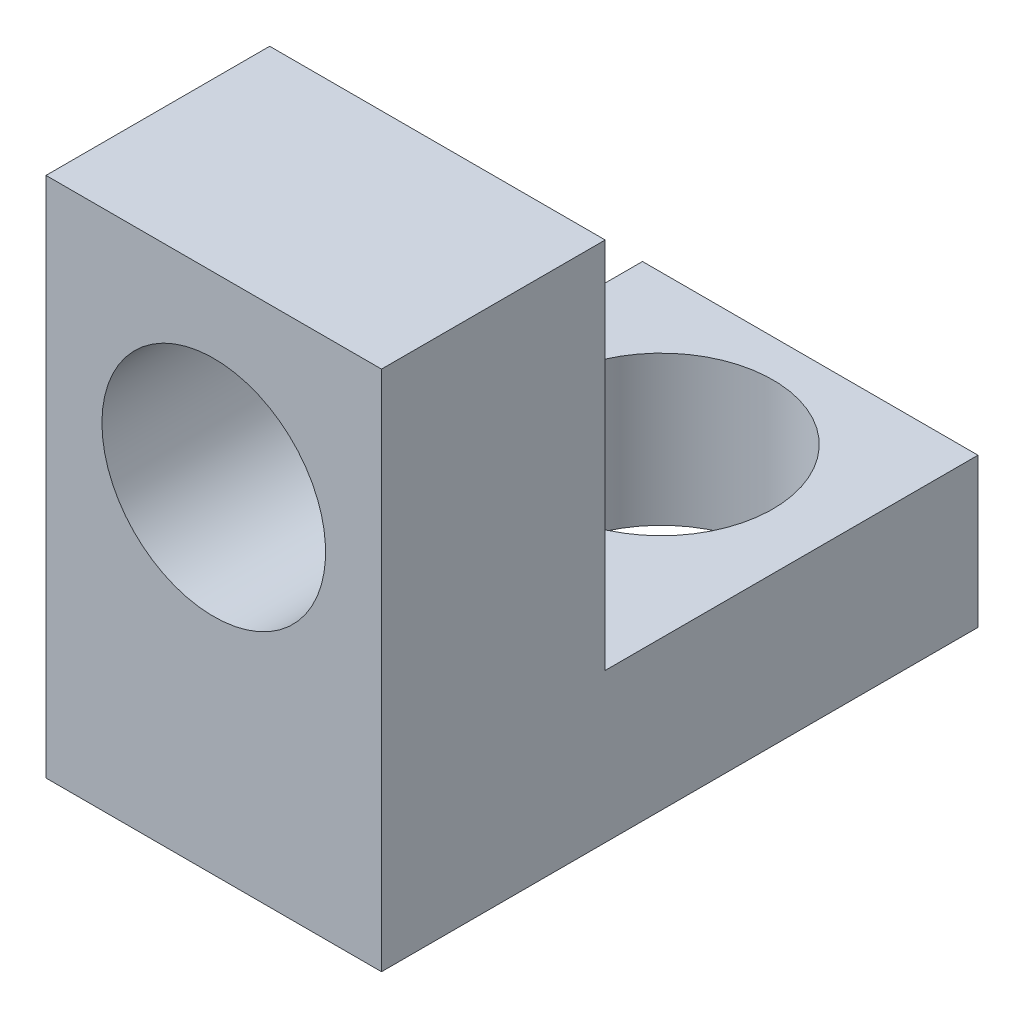
ISO-10303-21;
HEADER;
FILE_DESCRIPTION(('STEP AP214'),'2;1');
FILE_NAME('part.step','',(''),(''),'','','');
FILE_SCHEMA(('AUTOMOTIVE_DESIGN { 1 0 10303 214 1 1 1 1 }'));
ENDSEC;
DATA;
#1=APPLICATION_CONTEXT('core data for automotive mechanical design processes');
#2=APPLICATION_PROTOCOL_DEFINITION('international standard','automotive_design',2000,#1);
#3=PRODUCT_CONTEXT('',#1,'mechanical');
#4=PRODUCT('Part','Part','',(#3));
#5=PRODUCT_RELATED_PRODUCT_CATEGORY('part','',(#4));
#6=PRODUCT_DEFINITION_FORMATION('','',#4);
#7=PRODUCT_DEFINITION_CONTEXT('part definition',#1,'design');
#8=PRODUCT_DEFINITION('design','',#6,#7);
#9=PRODUCT_DEFINITION_SHAPE('','',#8);
#10=(LENGTH_UNIT() NAMED_UNIT(*) SI_UNIT(.MILLI.,.METRE.));
#11=(NAMED_UNIT(*) PLANE_ANGLE_UNIT() SI_UNIT($,.RADIAN.));
#12=(NAMED_UNIT(*) SI_UNIT($,.STERADIAN.) SOLID_ANGLE_UNIT());
#13=UNCERTAINTY_MEASURE_WITH_UNIT(LENGTH_MEASURE(1.E-05),#10,'distance_accuracy_value','');
#14=(GEOMETRIC_REPRESENTATION_CONTEXT(3) GLOBAL_UNCERTAINTY_ASSIGNED_CONTEXT((#13)) GLOBAL_UNIT_ASSIGNED_CONTEXT((#10,
#11,#12)) REPRESENTATION_CONTEXT('',''));
#15=CARTESIAN_POINT('',(0.,0.,0.));
#16=DIRECTION('',(0.,0.,1.));
#17=DIRECTION('',(1.,0.,0.));
#18=AXIS2_PLACEMENT_3D('',#15,#16,#17);
#19=CARTESIAN_POINT('',(2.25,2.,-4.));
#20=DIRECTION('',(-1.,0.,0.));
#21=DIRECTION('',(0.,0.,1.));
#22=AXIS2_PLACEMENT_3D('',#19,#20,#21);
#23=PLANE('',#22);
#24=DIRECTION('',(0.,0.,-1.));
#25=VECTOR('',#24,1.);
#26=CARTESIAN_POINT('',(2.25,0.,-4.));
#27=LINE('',#26,#25);
#28=CARTESIAN_POINT('',(2.25,0.,4.));
#29=VERTEX_POINT('',#28);
#30=CARTESIAN_POINT('',(2.25,0.,-4.));
#31=VERTEX_POINT('',#30);
#32=EDGE_CURVE('E104',#29,#31,#27,.T.);
#33=ORIENTED_EDGE('',*,*,#32,.T.);
#34=DIRECTION('',(0.,-1.,0.));
#35=VECTOR('',#34,1.);
#36=CARTESIAN_POINT('',(2.25,2.,-4.));
#37=LINE('',#36,#35);
#38=CARTESIAN_POINT('',(2.25,2.,-4.));
#39=VERTEX_POINT('',#38);
#40=EDGE_CURVE('E11',#39,#31,#37,.T.);
#41=ORIENTED_EDGE('',*,*,#40,.F.);
#42=DIRECTION('',(0.,0.,-1.));
#43=VECTOR('',#42,1.);
#44=CARTESIAN_POINT('',(2.25,2.,-4.));
#45=LINE('',#44,#43);
#46=CARTESIAN_POINT('',(2.25,2.,0.999999999999999));
#47=VERTEX_POINT('',#46);
#48=EDGE_CURVE('E97',#47,#39,#45,.T.);
#49=ORIENTED_EDGE('',*,*,#48,.F.);
#50=DIRECTION('',(0.,-1.,0.));
#51=VECTOR('',#50,1.);
#52=CARTESIAN_POINT('',(2.25,7.,0.999999999999999));
#53=LINE('',#52,#51);
#54=CARTESIAN_POINT('',(2.25,7.,0.999999999999999));
#55=VERTEX_POINT('',#54);
#56=EDGE_CURVE('E138',#55,#47,#53,.T.);
#57=ORIENTED_EDGE('',*,*,#56,.F.);
#58=DIRECTION('',(0.,0.,-1.));
#59=VECTOR('',#58,1.);
#60=CARTESIAN_POINT('',(2.25,7.,4.));
#61=LINE('',#60,#59);
#62=CARTESIAN_POINT('',(2.25,7.,4.));
#63=VERTEX_POINT('',#62);
#64=EDGE_CURVE('E107',#63,#55,#61,.T.);
#65=ORIENTED_EDGE('',*,*,#64,.F.);
#66=DIRECTION('',(0.,-1.,0.));
#67=VECTOR('',#66,1.);
#68=CARTESIAN_POINT('',(2.25,2.,4.));
#69=LINE('',#68,#67);
#70=EDGE_CURVE('E89',#63,#29,#69,.T.);
#71=ORIENTED_EDGE('',*,*,#70,.T.);
#72=EDGE_LOOP('',(#33,#41,#49,#57,#65,#71));
#73=FACE_BOUND('',#72,.T.);
#74=ADVANCED_FACE('F43',(#73),#23,.F.);
#75=CARTESIAN_POINT('',(-2.25,2.,-4.));
#76=DIRECTION('',(0.,0.,1.));
#77=DIRECTION('',(1.,0.,0.));
#78=AXIS2_PLACEMENT_3D('',#75,#76,#77);
#79=PLANE('',#78);
#80=DIRECTION('',(-1.,0.,0.));
#81=VECTOR('',#80,1.);
#82=CARTESIAN_POINT('',(-2.25,0.,-4.));
#83=LINE('',#82,#81);
#84=CARTESIAN_POINT('',(-2.25,0.,-4.));
#85=VERTEX_POINT('',#84);
#86=EDGE_CURVE('E112',#31,#85,#83,.T.);
#87=ORIENTED_EDGE('',*,*,#86,.T.);
#88=DIRECTION('',(0.,-1.,0.));
#89=VECTOR('',#88,1.);
#90=CARTESIAN_POINT('',(-2.25,2.,-4.));
#91=LINE('',#90,#89);
#92=CARTESIAN_POINT('',(-2.25,2.,-4.));
#93=VERTEX_POINT('',#92);
#94=EDGE_CURVE('E51',#93,#85,#91,.T.);
#95=ORIENTED_EDGE('',*,*,#94,.F.);
#96=DIRECTION('',(-1.,0.,0.));
#97=VECTOR('',#96,1.);
#98=CARTESIAN_POINT('',(-2.25,2.,-4.));
#99=LINE('',#98,#97);
#100=EDGE_CURVE('E64',#39,#93,#99,.T.);
#101=ORIENTED_EDGE('',*,*,#100,.F.);
#102=ORIENTED_EDGE('',*,*,#40,.T.);
#103=EDGE_LOOP('',(#87,#95,#101,#102));
#104=FACE_BOUND('',#103,.T.);
#105=ADVANCED_FACE('F135',(#104),#79,.F.);
#106=CARTESIAN_POINT('',(-2.25,2.,-4.));
#107=DIRECTION('',(1.,0.,0.));
#108=DIRECTION('',(0.,0.,-1.));
#109=AXIS2_PLACEMENT_3D('',#106,#107,#108);
#110=PLANE('',#109);
#111=DIRECTION('',(0.,0.,1.));
#112=VECTOR('',#111,1.);
#113=CARTESIAN_POINT('',(-2.25,0.,-4.));
#114=LINE('',#113,#112);
#115=CARTESIAN_POINT('',(-2.25,0.,4.));
#116=VERTEX_POINT('',#115);
#117=EDGE_CURVE('E98',#85,#116,#114,.T.);
#118=ORIENTED_EDGE('',*,*,#117,.T.);
#119=DIRECTION('',(0.,-1.,0.));
#120=VECTOR('',#119,1.);
#121=CARTESIAN_POINT('',(-2.25,2.,4.));
#122=LINE('',#121,#120);
#123=CARTESIAN_POINT('',(-2.25,7.,4.));
#124=VERTEX_POINT('',#123);
#125=EDGE_CURVE('E92',#124,#116,#122,.T.);
#126=ORIENTED_EDGE('',*,*,#125,.F.);
#127=DIRECTION('',(0.,0.,1.));
#128=VECTOR('',#127,1.);
#129=CARTESIAN_POINT('',(-2.25,7.,4.));
#130=LINE('',#129,#128);
#131=CARTESIAN_POINT('',(-2.25,7.,0.999999999999999));
#132=VERTEX_POINT('',#131);
#133=EDGE_CURVE('E175',#132,#124,#130,.T.);
#134=ORIENTED_EDGE('',*,*,#133,.F.);
#135=DIRECTION('',(0.,-1.,0.));
#136=VECTOR('',#135,1.);
#137=CARTESIAN_POINT('',(-2.25,7.,0.999999999999999));
#138=LINE('',#137,#136);
#139=CARTESIAN_POINT('',(-2.25,2.,0.999999999999999));
#140=VERTEX_POINT('',#139);
#141=EDGE_CURVE('E149',#132,#140,#138,.T.);
#142=ORIENTED_EDGE('',*,*,#141,.T.);
#143=DIRECTION('',(0.,0.,1.));
#144=VECTOR('',#143,1.);
#145=CARTESIAN_POINT('',(-2.25,2.,-4.));
#146=LINE('',#145,#144);
#147=EDGE_CURVE('E109',#93,#140,#146,.T.);
#148=ORIENTED_EDGE('',*,*,#147,.F.);
#149=ORIENTED_EDGE('',*,*,#94,.T.);
#150=EDGE_LOOP('',(#118,#126,#134,#142,#148,#149));
#151=FACE_BOUND('',#150,.T.);
#152=ADVANCED_FACE('F132',(#151),#110,.F.);
#153=CARTESIAN_POINT('',(-2.25,2.,4.));
#154=DIRECTION('',(0.,0.,-1.));
#155=DIRECTION('',(-1.,0.,0.));
#156=AXIS2_PLACEMENT_3D('',#153,#154,#155);
#157=PLANE('',#156);
#158=CARTESIAN_POINT('',(0.,4.5,4.));
#159=DIRECTION('',(0.,0.,-1.));
#160=DIRECTION('',(-1.,0.,0.));
#161=AXIS2_PLACEMENT_3D('',#158,#159,#160);
#162=CIRCLE('',#161,1.5);
#163=CARTESIAN_POINT('',(-1.5,4.5,4.));
#164=VERTEX_POINT('',#163);
#165=EDGE_CURVE('E179',#164,#164,#162,.T.);
#166=ORIENTED_EDGE('',*,*,#165,.T.);
#167=EDGE_LOOP('',(#166));
#168=FACE_BOUND('',#167,.T.);
#169=DIRECTION('',(1.,0.,0.));
#170=VECTOR('',#169,1.);
#171=CARTESIAN_POINT('',(-2.25,0.,4.));
#172=LINE('',#171,#170);
#173=EDGE_CURVE('E84',#116,#29,#172,.T.);
#174=ORIENTED_EDGE('',*,*,#173,.T.);
#175=ORIENTED_EDGE('',*,*,#70,.F.);
#176=DIRECTION('',(1.,0.,0.));
#177=VECTOR('',#176,1.);
#178=CARTESIAN_POINT('',(-2.25,7.,4.));
#179=LINE('',#178,#177);
#180=EDGE_CURVE('E169',#124,#63,#179,.T.);
#181=ORIENTED_EDGE('',*,*,#180,.F.);
#182=ORIENTED_EDGE('',*,*,#125,.T.);
#183=EDGE_LOOP('',(#174,#175,#181,#182));
#184=FACE_BOUND('',#183,.T.);
#185=ADVANCED_FACE('F86',(#168,#184),#157,.F.);
#186=CARTESIAN_POINT('',(0.,2.,0.));
#187=DIRECTION('',(0.,1.,0.));
#188=DIRECTION('',(0.,0.,1.));
#189=AXIS2_PLACEMENT_3D('',#186,#187,#188);
#190=PLANE('',#189);
#191=DIRECTION('',(-1.,0.,0.));
#192=VECTOR('',#191,1.);
#193=CARTESIAN_POINT('',(-2.25,2.,0.999999999999999));
#194=LINE('',#193,#192);
#195=EDGE_CURVE('E58',#47,#140,#194,.T.);
#196=ORIENTED_EDGE('',*,*,#195,.F.);
#197=ORIENTED_EDGE('',*,*,#48,.T.);
#198=ORIENTED_EDGE('',*,*,#100,.T.);
#199=ORIENTED_EDGE('',*,*,#147,.T.);
#200=EDGE_LOOP('',(#196,#197,#198,#199));
#201=FACE_BOUND('',#200,.T.);
#202=CARTESIAN_POINT('',(0.,2.,-2.));
#203=DIRECTION('',(0.,1.,0.));
#204=DIRECTION('',(0.,0.,1.));
#205=AXIS2_PLACEMENT_3D('',#202,#203,#204);
#206=CIRCLE('',#205,1.5);
#207=CARTESIAN_POINT('',(0.,2.,-0.500000000000001));
#208=VERTEX_POINT('',#207);
#209=EDGE_CURVE('E120',#208,#208,#206,.T.);
#210=ORIENTED_EDGE('',*,*,#209,.F.);
#211=EDGE_LOOP('',(#210));
#212=FACE_BOUND('',#211,.T.);
#213=ADVANCED_FACE('F159',(#201,#212),#190,.T.);
#214=CARTESIAN_POINT('',(0.,0.,0.));
#215=DIRECTION('',(0.,1.,0.));
#216=DIRECTION('',(0.,0.,1.));
#217=AXIS2_PLACEMENT_3D('',#214,#215,#216);
#218=PLANE('',#217);
#219=CARTESIAN_POINT('',(0.,0.,-2.));
#220=DIRECTION('',(0.,1.,0.));
#221=DIRECTION('',(0.,0.,1.));
#222=AXIS2_PLACEMENT_3D('',#219,#220,#221);
#223=CIRCLE('',#222,1.5);
#224=CARTESIAN_POINT('',(0.,0.,-0.500000000000001));
#225=VERTEX_POINT('',#224);
#226=EDGE_CURVE('E114',#225,#225,#223,.T.);
#227=ORIENTED_EDGE('',*,*,#226,.T.);
#228=EDGE_LOOP('',(#227));
#229=FACE_BOUND('',#228,.T.);
#230=ORIENTED_EDGE('',*,*,#32,.F.);
#231=ORIENTED_EDGE('',*,*,#173,.F.);
#232=ORIENTED_EDGE('',*,*,#117,.F.);
#233=ORIENTED_EDGE('',*,*,#86,.F.);
#234=EDGE_LOOP('',(#230,#231,#232,#233));
#235=FACE_BOUND('',#234,.T.);
#236=ADVANCED_FACE('F111',(#229,#235),#218,.F.);
#237=CARTESIAN_POINT('',(0.,0.,-2.));
#238=DIRECTION('',(0.,1.,0.));
#239=DIRECTION('',(0.,0.,1.));
#240=AXIS2_PLACEMENT_3D('',#237,#238,#239);
#241=CYLINDRICAL_SURFACE('',#240,1.5);
#242=ORIENTED_EDGE('',*,*,#226,.F.);
#243=EDGE_LOOP('',(#242));
#244=FACE_BOUND('',#243,.T.);
#245=ORIENTED_EDGE('',*,*,#209,.T.);
#246=EDGE_LOOP('',(#245));
#247=FACE_BOUND('',#246,.T.);
#248=ADVANCED_FACE('F196',(#244,#247),#241,.F.);
#249=CARTESIAN_POINT('',(-2.25,7.,0.999999999999999));
#250=DIRECTION('',(0.,0.,1.));
#251=DIRECTION('',(1.,0.,0.));
#252=AXIS2_PLACEMENT_3D('',#249,#250,#251);
#253=PLANE('',#252);
#254=CARTESIAN_POINT('',(0.,4.5,0.999999999999999));
#255=DIRECTION('',(0.,0.,-1.));
#256=DIRECTION('',(-1.,0.,0.));
#257=AXIS2_PLACEMENT_3D('',#254,#255,#256);
#258=CIRCLE('',#257,1.5);
#259=CARTESIAN_POINT('',(-1.5,4.5,0.999999999999999));
#260=VERTEX_POINT('',#259);
#261=EDGE_CURVE('E183',#260,#260,#258,.T.);
#262=ORIENTED_EDGE('',*,*,#261,.F.);
#263=EDGE_LOOP('',(#262));
#264=FACE_BOUND('',#263,.T.);
#265=ORIENTED_EDGE('',*,*,#195,.T.);
#266=ORIENTED_EDGE('',*,*,#141,.F.);
#267=DIRECTION('',(-1.,0.,0.));
#268=VECTOR('',#267,1.);
#269=CARTESIAN_POINT('',(-2.25,7.,0.999999999999999));
#270=LINE('',#269,#268);
#271=EDGE_CURVE('E147',#55,#132,#270,.T.);
#272=ORIENTED_EDGE('',*,*,#271,.F.);
#273=ORIENTED_EDGE('',*,*,#56,.T.);
#274=EDGE_LOOP('',(#265,#266,#272,#273));
#275=FACE_BOUND('',#274,.T.);
#276=ADVANCED_FACE('F143',(#264,#275),#253,.F.);
#277=CARTESIAN_POINT('',(0.,7.,0.));
#278=DIRECTION('',(0.,-1.,0.));
#279=DIRECTION('',(0.,0.,-1.));
#280=AXIS2_PLACEMENT_3D('',#277,#278,#279);
#281=PLANE('',#280);
#282=ORIENTED_EDGE('',*,*,#133,.T.);
#283=ORIENTED_EDGE('',*,*,#180,.T.);
#284=ORIENTED_EDGE('',*,*,#64,.T.);
#285=ORIENTED_EDGE('',*,*,#271,.T.);
#286=EDGE_LOOP('',(#282,#283,#284,#285));
#287=FACE_BOUND('',#286,.T.);
#288=ADVANCED_FACE('F168',(#287),#281,.F.);
#289=CARTESIAN_POINT('',(0.,4.5,6.));
#290=DIRECTION('',(0.,0.,-1.));
#291=DIRECTION('',(-1.,0.,0.));
#292=AXIS2_PLACEMENT_3D('',#289,#290,#291);
#293=CYLINDRICAL_SURFACE('',#292,1.5);
#294=ORIENTED_EDGE('',*,*,#261,.T.);
#295=EDGE_LOOP('',(#294));
#296=FACE_BOUND('',#295,.T.);
#297=ORIENTED_EDGE('',*,*,#165,.F.);
#298=EDGE_LOOP('',(#297));
#299=FACE_BOUND('',#298,.T.);
#300=ADVANCED_FACE('F192',(#296,#299),#293,.F.);
#301=CLOSED_SHELL('',(#74,#105,#152,#185,#213,#236,#248,#276,#288,#300));
#302=MANIFOLD_SOLID_BREP('B2',#301);
#303=ADVANCED_BREP_SHAPE_REPRESENTATION('',(#18,#302),#14);
#304=SHAPE_DEFINITION_REPRESENTATION(#9,#303);
ENDSEC;
END-ISO-10303-21;
